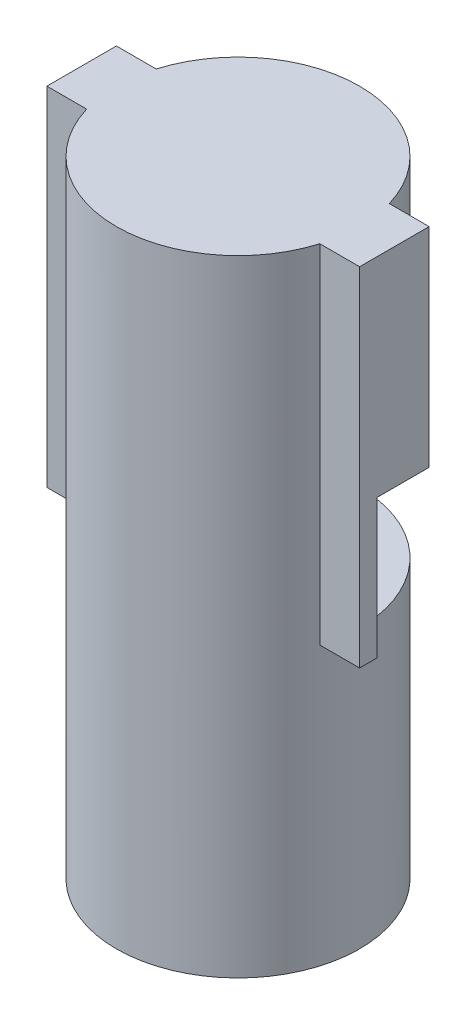
ISO-10303-21;
HEADER;
FILE_DESCRIPTION(('STEP AP214'),'2;1');
FILE_NAME('part.step','',(''),(''),'','','');
FILE_SCHEMA(('AUTOMOTIVE_DESIGN { 1 0 10303 214 1 1 1 1 }'));
ENDSEC;
DATA;
#1=APPLICATION_CONTEXT('core data for automotive mechanical design processes');
#2=APPLICATION_PROTOCOL_DEFINITION('international standard','automotive_design',2000,#1);
#3=PRODUCT_CONTEXT('',#1,'mechanical');
#4=PRODUCT('Part','Part','',(#3));
#5=PRODUCT_RELATED_PRODUCT_CATEGORY('part','',(#4));
#6=PRODUCT_DEFINITION_FORMATION('','',#4);
#7=PRODUCT_DEFINITION_CONTEXT('part definition',#1,'design');
#8=PRODUCT_DEFINITION('design','',#6,#7);
#9=PRODUCT_DEFINITION_SHAPE('','',#8);
#10=(LENGTH_UNIT() NAMED_UNIT(*) SI_UNIT(.MILLI.,.METRE.));
#11=(NAMED_UNIT(*) PLANE_ANGLE_UNIT() SI_UNIT($,.RADIAN.));
#12=(NAMED_UNIT(*) SI_UNIT($,.STERADIAN.) SOLID_ANGLE_UNIT());
#13=UNCERTAINTY_MEASURE_WITH_UNIT(LENGTH_MEASURE(1.E-05),#10,'distance_accuracy_value','');
#14=(GEOMETRIC_REPRESENTATION_CONTEXT(3) GLOBAL_UNCERTAINTY_ASSIGNED_CONTEXT((#13)) GLOBAL_UNIT_ASSIGNED_CONTEXT((#10,
#11,#12)) REPRESENTATION_CONTEXT('',''));
#15=CARTESIAN_POINT('',(0.,0.,0.));
#16=DIRECTION('',(0.,0.,1.));
#17=DIRECTION('',(1.,0.,0.));
#18=AXIS2_PLACEMENT_3D('',#15,#16,#17);
#19=CARTESIAN_POINT('',(0.,18.,0.));
#20=DIRECTION('',(0.,-1.,0.));
#21=DIRECTION('',(0.,0.,-1.));
#22=AXIS2_PLACEMENT_3D('',#19,#20,#21);
#23=CYLINDRICAL_SURFACE('',#22,3.5);
#24=DIRECTION('',(0.,-1.,0.));
#25=VECTOR('',#24,1.);
#26=CARTESIAN_POINT('',(3.35410196624968,18.,-1.));
#27=LINE('',#26,#25);
#28=CARTESIAN_POINT('',(3.35410196624968,18.,-1.));
#29=VERTEX_POINT('',#28);
#30=CARTESIAN_POINT('',(3.35410196624968,12.,-1.));
#31=VERTEX_POINT('',#30);
#32=EDGE_CURVE('E178',#29,#31,#27,.T.);
#33=ORIENTED_EDGE('',*,*,#32,.T.);
#34=CARTESIAN_POINT('',(0.,12.,0.));
#35=DIRECTION('',(0.,-1.,0.));
#36=DIRECTION('',(0.,0.,-1.));
#37=AXIS2_PLACEMENT_3D('',#34,#35,#36);
#38=CIRCLE('',#37,3.5);
#39=CARTESIAN_POINT('',(-3.35410196624968,12.,-1.));
#40=VERTEX_POINT('',#39);
#41=EDGE_CURVE('E209',#40,#31,#38,.T.);
#42=ORIENTED_EDGE('',*,*,#41,.F.);
#43=DIRECTION('',(0.,-1.,0.));
#44=VECTOR('',#43,1.);
#45=CARTESIAN_POINT('',(-3.35410196624968,18.,-1.));
#46=LINE('',#45,#44);
#47=CARTESIAN_POINT('',(-3.35410196624968,18.,-1.));
#48=VERTEX_POINT('',#47);
#49=EDGE_CURVE('E176',#40,#48,#46,.F.);
#50=ORIENTED_EDGE('',*,*,#49,.T.);
#51=CARTESIAN_POINT('',(0.,18.,0.));
#52=DIRECTION('',(0.,1.,0.));
#53=DIRECTION('',(0.,0.,1.));
#54=AXIS2_PLACEMENT_3D('',#51,#52,#53);
#55=CIRCLE('',#54,3.5);
#56=EDGE_CURVE('E184',#29,#48,#55,.T.);
#57=ORIENTED_EDGE('',*,*,#56,.F.);
#58=EDGE_LOOP('',(#33,#42,#50,#57));
#59=FACE_BOUND('',#58,.T.);
#60=ADVANCED_FACE('F35',(#59),#23,.T.);
#61=CARTESIAN_POINT('',(4.5,8.,-1.));
#62=DIRECTION('',(0.,0.,-1.));
#63=DIRECTION('',(-1.,0.,0.));
#64=AXIS2_PLACEMENT_3D('',#61,#62,#63);
#65=PLANE('',#64);
#66=ORIENTED_EDGE('',*,*,#49,.F.);
#67=DIRECTION('',(-1.,0.,0.));
#68=VECTOR('',#67,1.);
#69=CARTESIAN_POINT('',(4.5,12.,-1.));
#70=LINE('',#69,#68);
#71=CARTESIAN_POINT('',(-4.5,12.,-1.));
#72=VERTEX_POINT('',#71);
#73=EDGE_CURVE('E206',#40,#72,#70,.T.);
#74=ORIENTED_EDGE('',*,*,#73,.T.);
#75=DIRECTION('',(0.,1.,0.));
#76=VECTOR('',#75,1.);
#77=CARTESIAN_POINT('',(-4.5,8.,-1.));
#78=LINE('',#77,#76);
#79=CARTESIAN_POINT('',(-4.5,18.,-1.));
#80=VERTEX_POINT('',#79);
#81=EDGE_CURVE('E165',#72,#80,#78,.T.);
#82=ORIENTED_EDGE('',*,*,#81,.T.);
#83=DIRECTION('',(-1.,0.,0.));
#84=VECTOR('',#83,1.);
#85=CARTESIAN_POINT('',(4.5,18.,-1.));
#86=LINE('',#85,#84);
#87=EDGE_CURVE('E161',#48,#80,#86,.T.);
#88=ORIENTED_EDGE('',*,*,#87,.F.);
#89=EDGE_LOOP('',(#66,#74,#82,#88));
#90=FACE_BOUND('',#89,.T.);
#91=ADVANCED_FACE('F220',(#90),#65,.T.);
#92=DIRECTION('',(0.,1.,0.));
#93=VECTOR('',#92,1.);
#94=CARTESIAN_POINT('',(4.5,8.,-1.));
#95=LINE('',#94,#93);
#96=CARTESIAN_POINT('',(4.5,12.,-1.));
#97=VERTEX_POINT('',#96);
#98=CARTESIAN_POINT('',(4.5,18.,-1.));
#99=VERTEX_POINT('',#98);
#100=EDGE_CURVE('E168',#97,#99,#95,.T.);
#101=ORIENTED_EDGE('',*,*,#100,.F.);
#102=DIRECTION('',(-1.,0.,0.));
#103=VECTOR('',#102,1.);
#104=CARTESIAN_POINT('',(4.5,12.,-1.));
#105=LINE('',#104,#103);
#106=EDGE_CURVE('E50',#97,#31,#105,.T.);
#107=ORIENTED_EDGE('',*,*,#106,.T.);
#108=ORIENTED_EDGE('',*,*,#32,.F.);
#109=EDGE_CURVE('E162',#99,#29,#86,.T.);
#110=ORIENTED_EDGE('',*,*,#109,.F.);
#111=EDGE_LOOP('',(#101,#107,#108,#110));
#112=FACE_BOUND('',#111,.T.);
#113=ADVANCED_FACE('F229',(#112),#65,.T.);
#114=CARTESIAN_POINT('',(0.,8.,0.));
#115=DIRECTION('',(0.,-1.,0.));
#116=DIRECTION('',(0.,0.,-1.));
#117=AXIS2_PLACEMENT_3D('',#114,#115,#116);
#118=CIRCLE('',#117,3.5);
#119=CARTESIAN_POINT('',(-3.35410196624968,8.,1.));
#120=VERTEX_POINT('',#119);
#121=CARTESIAN_POINT('',(-3.46410161513775,8.,0.5));
#122=VERTEX_POINT('',#121);
#123=EDGE_CURVE('E187',#120,#122,#118,.T.);
#124=ORIENTED_EDGE('',*,*,#123,.T.);
#125=CARTESIAN_POINT('',(3.46410161513775,8.,0.500000000000002));
#126=VERTEX_POINT('',#125);
#127=EDGE_CURVE('E189',#122,#126,#118,.T.);
#128=ORIENTED_EDGE('',*,*,#127,.T.);
#129=CARTESIAN_POINT('',(3.35410196624968,8.,1.));
#130=VERTEX_POINT('',#129);
#131=EDGE_CURVE('E134',#126,#130,#118,.T.);
#132=ORIENTED_EDGE('',*,*,#131,.T.);
#133=DIRECTION('',(0.,-1.,0.));
#134=VECTOR('',#133,1.);
#135=CARTESIAN_POINT('',(3.35410196624968,18.,1.));
#136=LINE('',#135,#134);
#137=CARTESIAN_POINT('',(3.35410196624968,18.,1.));
#138=VERTEX_POINT('',#137);
#139=EDGE_CURVE('E167',#130,#138,#136,.F.);
#140=ORIENTED_EDGE('',*,*,#139,.T.);
#141=CARTESIAN_POINT('',(-3.35410196624968,18.,1.));
#142=VERTEX_POINT('',#141);
#143=EDGE_CURVE('E182',#142,#138,#55,.T.);
#144=ORIENTED_EDGE('',*,*,#143,.F.);
#145=DIRECTION('',(0.,-1.,0.));
#146=VECTOR('',#145,1.);
#147=CARTESIAN_POINT('',(-3.35410196624968,18.,1.));
#148=LINE('',#147,#146);
#149=EDGE_CURVE('E173',#142,#120,#148,.T.);
#150=ORIENTED_EDGE('',*,*,#149,.T.);
#151=EDGE_LOOP('',(#124,#128,#132,#140,#144,#150));
#152=FACE_BOUND('',#151,.T.);
#153=CARTESIAN_POINT('',(0.,0.,0.));
#154=DIRECTION('',(0.,1.,0.));
#155=DIRECTION('',(0.,0.,1.));
#156=AXIS2_PLACEMENT_3D('',#153,#154,#155);
#157=CIRCLE('',#156,3.5);
#158=CARTESIAN_POINT('',(0.,0.,3.5));
#159=VERTEX_POINT('',#158);
#160=EDGE_CURVE('E181',#159,#159,#157,.T.);
#161=ORIENTED_EDGE('',*,*,#160,.T.);
#162=EDGE_LOOP('',(#161));
#163=FACE_BOUND('',#162,.T.);
#164=ADVANCED_FACE('F37',(#152,#163),#23,.T.);
#165=CARTESIAN_POINT('',(0.,18.,0.));
#166=DIRECTION('',(0.,1.,0.));
#167=DIRECTION('',(0.,0.,1.));
#168=AXIS2_PLACEMENT_3D('',#165,#166,#167);
#169=PLANE('',#168);
#170=ORIENTED_EDGE('',*,*,#143,.T.);
#171=DIRECTION('',(1.,0.,0.));
#172=VECTOR('',#171,1.);
#173=CARTESIAN_POINT('',(4.5,18.,0.999999999999999));
#174=LINE('',#173,#172);
#175=CARTESIAN_POINT('',(4.5,18.,0.999999999999999));
#176=VERTEX_POINT('',#175);
#177=EDGE_CURVE('E155',#138,#176,#174,.T.);
#178=ORIENTED_EDGE('',*,*,#177,.T.);
#179=DIRECTION('',(0.,0.,-1.));
#180=VECTOR('',#179,1.);
#181=CARTESIAN_POINT('',(4.5,18.,-1.));
#182=LINE('',#181,#180);
#183=EDGE_CURVE('E158',#176,#99,#182,.T.);
#184=ORIENTED_EDGE('',*,*,#183,.T.);
#185=ORIENTED_EDGE('',*,*,#109,.T.);
#186=ORIENTED_EDGE('',*,*,#56,.T.);
#187=ORIENTED_EDGE('',*,*,#87,.T.);
#188=DIRECTION('',(0.,0.,1.));
#189=VECTOR('',#188,1.);
#190=CARTESIAN_POINT('',(-4.5,18.,-1.));
#191=LINE('',#190,#189);
#192=CARTESIAN_POINT('',(-4.5,18.,1.));
#193=VERTEX_POINT('',#192);
#194=EDGE_CURVE('E153',#80,#193,#191,.T.);
#195=ORIENTED_EDGE('',*,*,#194,.T.);
#196=EDGE_CURVE('E58',#193,#142,#174,.T.);
#197=ORIENTED_EDGE('',*,*,#196,.T.);
#198=EDGE_LOOP('',(#170,#178,#184,#185,#186,#187,#195,#197));
#199=FACE_BOUND('',#198,.T.);
#200=ADVANCED_FACE('F222',(#199),#169,.T.);
#201=CARTESIAN_POINT('',(0.,0.,0.));
#202=DIRECTION('',(0.,1.,0.));
#203=DIRECTION('',(0.,0.,1.));
#204=AXIS2_PLACEMENT_3D('',#201,#202,#203);
#205=PLANE('',#204);
#206=ORIENTED_EDGE('',*,*,#160,.F.);
#207=EDGE_LOOP('',(#206));
#208=FACE_BOUND('',#207,.T.);
#209=ADVANCED_FACE('F256',(#208),#205,.F.);
#210=CARTESIAN_POINT('',(-4.5,8.,-1.));
#211=DIRECTION('',(-1.,0.,0.));
#212=DIRECTION('',(0.,0.,1.));
#213=AXIS2_PLACEMENT_3D('',#210,#211,#212);
#214=PLANE('',#213);
#215=DIRECTION('',(0.,1.,0.));
#216=VECTOR('',#215,1.);
#217=CARTESIAN_POINT('',(-4.5,8.,0.5));
#218=LINE('',#217,#216);
#219=CARTESIAN_POINT('',(-4.5,8.,0.5));
#220=VERTEX_POINT('',#219);
#221=CARTESIAN_POINT('',(-4.5,12.,0.5));
#222=VERTEX_POINT('',#221);
#223=EDGE_CURVE('E156',#220,#222,#218,.T.);
#224=ORIENTED_EDGE('',*,*,#223,.F.);
#225=DIRECTION('',(0.,0.,1.));
#226=VECTOR('',#225,1.);
#227=CARTESIAN_POINT('',(-4.5,8.,-1.));
#228=LINE('',#227,#226);
#229=CARTESIAN_POINT('',(-4.5,8.,1.));
#230=VERTEX_POINT('',#229);
#231=EDGE_CURVE('E164',#220,#230,#228,.T.);
#232=ORIENTED_EDGE('',*,*,#231,.T.);
#233=DIRECTION('',(0.,1.,0.));
#234=VECTOR('',#233,1.);
#235=CARTESIAN_POINT('',(-4.5,8.,1.));
#236=LINE('',#235,#234);
#237=EDGE_CURVE('E144',#230,#193,#236,.T.);
#238=ORIENTED_EDGE('',*,*,#237,.T.);
#239=ORIENTED_EDGE('',*,*,#194,.F.);
#240=ORIENTED_EDGE('',*,*,#81,.F.);
#241=DIRECTION('',(0.,0.,1.));
#242=VECTOR('',#241,1.);
#243=CARTESIAN_POINT('',(-4.5,12.,-1.));
#244=LINE('',#243,#242);
#245=EDGE_CURVE('E203',#72,#222,#244,.T.);
#246=ORIENTED_EDGE('',*,*,#245,.T.);
#247=EDGE_LOOP('',(#224,#232,#238,#239,#240,#246));
#248=FACE_BOUND('',#247,.T.);
#249=ADVANCED_FACE('F214',(#248),#214,.T.);
#250=CARTESIAN_POINT('',(0.,8.,0.));
#251=DIRECTION('',(0.,-1.,0.));
#252=DIRECTION('',(0.,0.,-1.));
#253=AXIS2_PLACEMENT_3D('',#250,#251,#252);
#254=PLANE('',#253);
#255=DIRECTION('',(-1.,0.,0.));
#256=VECTOR('',#255,1.);
#257=CARTESIAN_POINT('',(-5.,8.,0.5));
#258=LINE('',#257,#256);
#259=EDGE_CURVE('E138',#122,#220,#258,.T.);
#260=ORIENTED_EDGE('',*,*,#259,.F.);
#261=ORIENTED_EDGE('',*,*,#123,.F.);
#262=DIRECTION('',(1.,0.,0.));
#263=VECTOR('',#262,1.);
#264=CARTESIAN_POINT('',(4.5,8.,0.999999999999999));
#265=LINE('',#264,#263);
#266=EDGE_CURVE('E145',#230,#120,#265,.T.);
#267=ORIENTED_EDGE('',*,*,#266,.F.);
#268=ORIENTED_EDGE('',*,*,#231,.F.);
#269=EDGE_LOOP('',(#260,#261,#267,#268));
#270=FACE_BOUND('',#269,.T.);
#271=ADVANCED_FACE('F235',(#270),#254,.T.);
#272=CARTESIAN_POINT('',(4.5,8.,0.999999999999999));
#273=DIRECTION('',(0.,0.,1.));
#274=DIRECTION('',(1.,0.,0.));
#275=AXIS2_PLACEMENT_3D('',#272,#273,#274);
#276=PLANE('',#275);
#277=ORIENTED_EDGE('',*,*,#149,.F.);
#278=ORIENTED_EDGE('',*,*,#196,.F.);
#279=ORIENTED_EDGE('',*,*,#237,.F.);
#280=ORIENTED_EDGE('',*,*,#266,.T.);
#281=EDGE_LOOP('',(#277,#278,#279,#280));
#282=FACE_BOUND('',#281,.T.);
#283=ADVANCED_FACE('F231',(#282),#276,.T.);
#284=CARTESIAN_POINT('',(4.5,8.,0.500000000000002));
#285=VERTEX_POINT('',#284);
#286=EDGE_CURVE('E123',#285,#126,#258,.T.);
#287=ORIENTED_EDGE('',*,*,#286,.F.);
#288=DIRECTION('',(0.,0.,-1.));
#289=VECTOR('',#288,1.);
#290=CARTESIAN_POINT('',(4.5,8.,-1.));
#291=LINE('',#290,#289);
#292=CARTESIAN_POINT('',(4.5,8.,0.999999999999999));
#293=VERTEX_POINT('',#292);
#294=EDGE_CURVE('E133',#293,#285,#291,.T.);
#295=ORIENTED_EDGE('',*,*,#294,.F.);
#296=EDGE_CURVE('E149',#130,#293,#265,.T.);
#297=ORIENTED_EDGE('',*,*,#296,.F.);
#298=ORIENTED_EDGE('',*,*,#131,.F.);
#299=EDGE_LOOP('',(#287,#295,#297,#298));
#300=FACE_BOUND('',#299,.T.);
#301=ADVANCED_FACE('F131',(#300),#254,.T.);
#302=ORIENTED_EDGE('',*,*,#139,.F.);
#303=ORIENTED_EDGE('',*,*,#296,.T.);
#304=DIRECTION('',(0.,1.,0.));
#305=VECTOR('',#304,1.);
#306=CARTESIAN_POINT('',(4.5,8.,0.999999999999999));
#307=LINE('',#306,#305);
#308=EDGE_CURVE('E143',#293,#176,#307,.T.);
#309=ORIENTED_EDGE('',*,*,#308,.T.);
#310=ORIENTED_EDGE('',*,*,#177,.F.);
#311=EDGE_LOOP('',(#302,#303,#309,#310));
#312=FACE_BOUND('',#311,.T.);
#313=ADVANCED_FACE('F196',(#312),#276,.T.);
#314=CARTESIAN_POINT('',(4.5,8.,-1.));
#315=DIRECTION('',(1.,0.,0.));
#316=DIRECTION('',(0.,0.,-1.));
#317=AXIS2_PLACEMENT_3D('',#314,#315,#316);
#318=PLANE('',#317);
#319=DIRECTION('',(0.,-1.,0.));
#320=VECTOR('',#319,1.);
#321=CARTESIAN_POINT('',(4.5,8.,0.500000000000002));
#322=LINE('',#321,#320);
#323=CARTESIAN_POINT('',(4.5,12.,0.500000000000002));
#324=VERTEX_POINT('',#323);
#325=EDGE_CURVE('E11',#324,#285,#322,.T.);
#326=ORIENTED_EDGE('',*,*,#325,.F.);
#327=DIRECTION('',(0.,0.,-1.));
#328=VECTOR('',#327,1.);
#329=CARTESIAN_POINT('',(4.5,12.,-1.));
#330=LINE('',#329,#328);
#331=EDGE_CURVE('E43',#324,#97,#330,.T.);
#332=ORIENTED_EDGE('',*,*,#331,.T.);
#333=ORIENTED_EDGE('',*,*,#100,.T.);
#334=ORIENTED_EDGE('',*,*,#183,.F.);
#335=ORIENTED_EDGE('',*,*,#308,.F.);
#336=ORIENTED_EDGE('',*,*,#294,.T.);
#337=EDGE_LOOP('',(#326,#332,#333,#334,#335,#336));
#338=FACE_BOUND('',#337,.T.);
#339=ADVANCED_FACE('F140',(#338),#318,.T.);
#340=CARTESIAN_POINT('',(0.,12.,0.));
#341=DIRECTION('',(0.,-1.,0.));
#342=DIRECTION('',(0.,0.,-1.));
#343=AXIS2_PLACEMENT_3D('',#340,#341,#342);
#344=PLANE('',#343);
#345=ORIENTED_EDGE('',*,*,#73,.F.);
#346=ORIENTED_EDGE('',*,*,#41,.T.);
#347=ORIENTED_EDGE('',*,*,#106,.F.);
#348=ORIENTED_EDGE('',*,*,#331,.F.);
#349=DIRECTION('',(-1.,0.,0.));
#350=VECTOR('',#349,1.);
#351=CARTESIAN_POINT('',(-5.,12.,0.5));
#352=LINE('',#351,#350);
#353=EDGE_CURVE('E126',#324,#222,#352,.T.);
#354=ORIENTED_EDGE('',*,*,#353,.T.);
#355=ORIENTED_EDGE('',*,*,#245,.F.);
#356=EDGE_LOOP('',(#345,#346,#347,#348,#354,#355));
#357=FACE_BOUND('',#356,.T.);
#358=ADVANCED_FACE('F212',(#357),#344,.T.);
#359=CARTESIAN_POINT('',(0.,8.,0.));
#360=DIRECTION('',(0.,-1.,0.));
#361=DIRECTION('',(0.,0.,-1.));
#362=AXIS2_PLACEMENT_3D('',#359,#360,#361);
#363=PLANE('',#362);
#364=ORIENTED_EDGE('',*,*,#127,.F.);
#365=EDGE_CURVE('E136',#126,#122,#258,.T.);
#366=ORIENTED_EDGE('',*,*,#365,.F.);
#367=EDGE_LOOP('',(#364,#366));
#368=FACE_BOUND('',#367,.T.);
#369=ADVANCED_FACE('F237',(#368),#363,.F.);
#370=CARTESIAN_POINT('',(-5.,12.,0.5));
#371=DIRECTION('',(0.,0.,1.));
#372=DIRECTION('',(1.,0.,0.));
#373=AXIS2_PLACEMENT_3D('',#370,#371,#372);
#374=PLANE('',#373);
#375=ORIENTED_EDGE('',*,*,#223,.T.);
#376=ORIENTED_EDGE('',*,*,#353,.F.);
#377=ORIENTED_EDGE('',*,*,#325,.T.);
#378=ORIENTED_EDGE('',*,*,#286,.T.);
#379=ORIENTED_EDGE('',*,*,#365,.T.);
#380=ORIENTED_EDGE('',*,*,#259,.T.);
#381=EDGE_LOOP('',(#375,#376,#377,#378,#379,#380));
#382=FACE_BOUND('',#381,.T.);
#383=ADVANCED_FACE('F121',(#382),#374,.F.);
#384=CLOSED_SHELL('',(#60,#91,#113,#164,#200,#209,#249,#271,#283,#301,#313,#339,#358,#369,#383));
#385=MANIFOLD_SOLID_BREP('B2',#384);
#386=ADVANCED_BREP_SHAPE_REPRESENTATION('',(#18,#385),#14);
#387=SHAPE_DEFINITION_REPRESENTATION(#9,#386);
ENDSEC;
END-ISO-10303-21;
